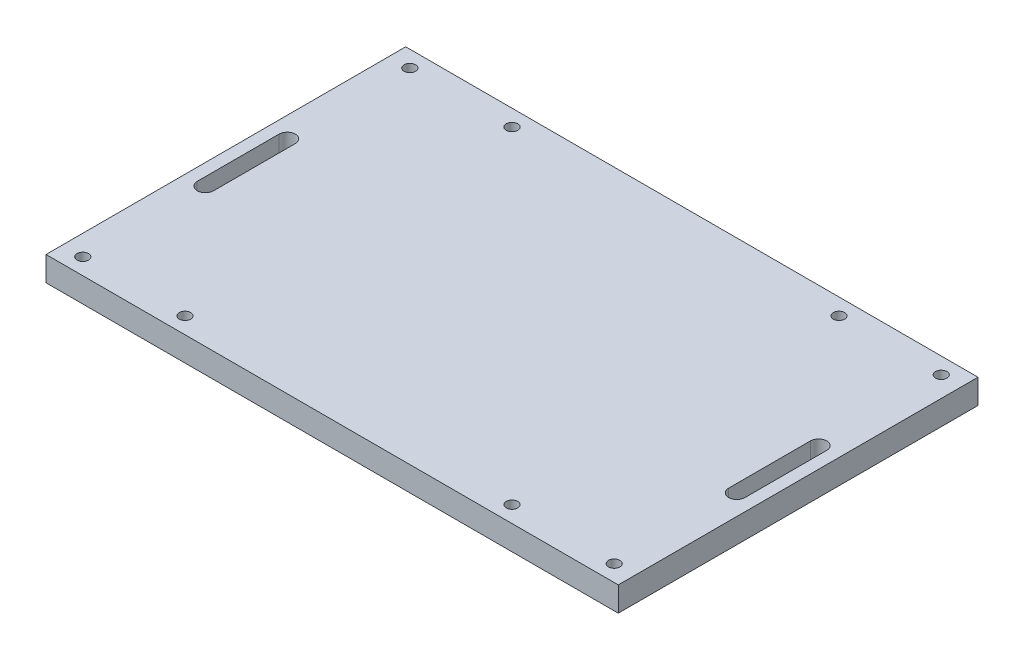
ISO-10303-21;
HEADER;
FILE_DESCRIPTION(('STEP AP214'),'2;1');
FILE_NAME('part.step','',(''),(''),'','','');
FILE_SCHEMA(('AUTOMOTIVE_DESIGN { 1 0 10303 214 1 1 1 1 }'));
ENDSEC;
DATA;
#1=APPLICATION_CONTEXT('core data for automotive mechanical design processes');
#2=APPLICATION_PROTOCOL_DEFINITION('international standard','automotive_design',2000,#1);
#3=PRODUCT_CONTEXT('',#1,'mechanical');
#4=PRODUCT('Part','Part','',(#3));
#5=PRODUCT_RELATED_PRODUCT_CATEGORY('part','',(#4));
#6=PRODUCT_DEFINITION_FORMATION('','',#4);
#7=PRODUCT_DEFINITION_CONTEXT('part definition',#1,'design');
#8=PRODUCT_DEFINITION('design','',#6,#7);
#9=PRODUCT_DEFINITION_SHAPE('','',#8);
#10=(LENGTH_UNIT() NAMED_UNIT(*) SI_UNIT(.MILLI.,.METRE.));
#11=(NAMED_UNIT(*) PLANE_ANGLE_UNIT() SI_UNIT($,.RADIAN.));
#12=(NAMED_UNIT(*) SI_UNIT($,.STERADIAN.) SOLID_ANGLE_UNIT());
#13=UNCERTAINTY_MEASURE_WITH_UNIT(LENGTH_MEASURE(1.E-05),#10,'distance_accuracy_value','');
#14=(GEOMETRIC_REPRESENTATION_CONTEXT(3) GLOBAL_UNCERTAINTY_ASSIGNED_CONTEXT((#13)) GLOBAL_UNIT_ASSIGNED_CONTEXT((#10,
#11,#12)) REPRESENTATION_CONTEXT('',''));
#15=CARTESIAN_POINT('',(0.,0.,0.));
#16=DIRECTION('',(0.,0.,1.));
#17=DIRECTION('',(1.,0.,0.));
#18=AXIS2_PLACEMENT_3D('',#15,#16,#17);
#19=CARTESIAN_POINT('',(0.,7.5,0.));
#20=DIRECTION('',(0.,-1.,0.));
#21=DIRECTION('',(0.,0.,-1.));
#22=AXIS2_PLACEMENT_3D('',#19,#20,#21);
#23=PLANE('',#22);
#24=DIRECTION('',(0.,0.,-1.));
#25=VECTOR('',#24,1.);
#26=CARTESIAN_POINT('',(175.,7.5,110.));
#27=LINE('',#26,#25);
#28=CARTESIAN_POINT('',(175.,7.5,110.));
#29=VERTEX_POINT('',#28);
#30=CARTESIAN_POINT('',(175.,7.5,-110.));
#31=VERTEX_POINT('',#30);
#32=EDGE_CURVE('E261',#29,#31,#27,.T.);
#33=ORIENTED_EDGE('',*,*,#32,.T.);
#34=DIRECTION('',(-1.,0.,0.));
#35=VECTOR('',#34,1.);
#36=CARTESIAN_POINT('',(-175.,7.5,-110.));
#37=LINE('',#36,#35);
#38=CARTESIAN_POINT('',(-175.,7.5,-110.));
#39=VERTEX_POINT('',#38);
#40=EDGE_CURVE('E265',#31,#39,#37,.T.);
#41=ORIENTED_EDGE('',*,*,#40,.T.);
#42=DIRECTION('',(0.,0.,1.));
#43=VECTOR('',#42,1.);
#44=CARTESIAN_POINT('',(-175.,7.5,110.));
#45=LINE('',#44,#43);
#46=CARTESIAN_POINT('',(-175.,7.5,110.));
#47=VERTEX_POINT('',#46);
#48=EDGE_CURVE('E269',#39,#47,#45,.T.);
#49=ORIENTED_EDGE('',*,*,#48,.T.);
#50=DIRECTION('',(1.,0.,0.));
#51=VECTOR('',#50,1.);
#52=CARTESIAN_POINT('',(-175.,7.5,110.));
#53=LINE('',#52,#51);
#54=EDGE_CURVE('E272',#47,#29,#53,.T.);
#55=ORIENTED_EDGE('',*,*,#54,.T.);
#56=EDGE_LOOP('',(#33,#41,#49,#55));
#57=FACE_BOUND('',#56,.T.);
#58=CARTESIAN_POINT('',(-100.,7.5,-100.));
#59=DIRECTION('',(0.,-1.,0.));
#60=DIRECTION('',(0.,0.,-1.));
#61=AXIS2_PLACEMENT_3D('',#58,#59,#60);
#62=CIRCLE('',#61,3.50000000000001);
#63=CARTESIAN_POINT('',(-100.,7.5,-103.5));
#64=VERTEX_POINT('',#63);
#65=EDGE_CURVE('E256',#64,#64,#62,.T.);
#66=ORIENTED_EDGE('',*,*,#65,.T.);
#67=EDGE_LOOP('',(#66));
#68=FACE_BOUND('',#67,.T.);
#69=CARTESIAN_POINT('',(-100.,7.5,100.));
#70=DIRECTION('',(0.,-1.,0.));
#71=DIRECTION('',(0.,0.,-1.));
#72=AXIS2_PLACEMENT_3D('',#69,#70,#71);
#73=CIRCLE('',#72,3.50000000000001);
#74=CARTESIAN_POINT('',(-100.,7.5,96.5));
#75=VERTEX_POINT('',#74);
#76=EDGE_CURVE('E248',#75,#75,#73,.F.);
#77=ORIENTED_EDGE('',*,*,#76,.F.);
#78=EDGE_LOOP('',(#77));
#79=FACE_BOUND('',#78,.T.);
#80=CARTESIAN_POINT('',(100.,7.5,100.));
#81=DIRECTION('',(0.,-1.,0.));
#82=DIRECTION('',(0.,0.,-1.));
#83=AXIS2_PLACEMENT_3D('',#80,#81,#82);
#84=CIRCLE('',#83,3.50000000000001);
#85=CARTESIAN_POINT('',(100.,7.5,96.5));
#86=VERTEX_POINT('',#85);
#87=EDGE_CURVE('E240',#86,#86,#84,.T.);
#88=ORIENTED_EDGE('',*,*,#87,.T.);
#89=EDGE_LOOP('',(#88));
#90=FACE_BOUND('',#89,.T.);
#91=CARTESIAN_POINT('',(100.,7.5,-100.));
#92=DIRECTION('',(0.,-1.,0.));
#93=DIRECTION('',(0.,0.,-1.));
#94=AXIS2_PLACEMENT_3D('',#91,#92,#93);
#95=CIRCLE('',#94,3.50000000000001);
#96=CARTESIAN_POINT('',(100.,7.5,-103.5));
#97=VERTEX_POINT('',#96);
#98=EDGE_CURVE('E231',#97,#97,#95,.F.);
#99=ORIENTED_EDGE('',*,*,#98,.F.);
#100=EDGE_LOOP('',(#99));
#101=FACE_BOUND('',#100,.T.);
#102=DIRECTION('',(0.,0.,-1.));
#103=VECTOR('',#102,1.);
#104=CARTESIAN_POINT('',(-157.5,7.5,25.));
#105=LINE('',#104,#103);
#106=CARTESIAN_POINT('',(-157.5,7.5,25.));
#107=VERTEX_POINT('',#106);
#108=CARTESIAN_POINT('',(-157.5,7.5,-25.));
#109=VERTEX_POINT('',#108);
#110=EDGE_CURVE('E221',#107,#109,#105,.T.);
#111=ORIENTED_EDGE('',*,*,#110,.F.);
#112=CARTESIAN_POINT('',(-162.5,7.5,25.));
#113=DIRECTION('',(0.,1.,0.));
#114=DIRECTION('',(0.,0.,1.));
#115=AXIS2_PLACEMENT_3D('',#112,#113,#114);
#116=CIRCLE('',#115,5.);
#117=CARTESIAN_POINT('',(-167.5,7.5,25.));
#118=VERTEX_POINT('',#117);
#119=EDGE_CURVE('E232',#118,#107,#116,.T.);
#120=ORIENTED_EDGE('',*,*,#119,.F.);
#121=DIRECTION('',(0.,0.,1.));
#122=VECTOR('',#121,1.);
#123=CARTESIAN_POINT('',(-167.5,7.5,25.));
#124=LINE('',#123,#122);
#125=CARTESIAN_POINT('',(-167.5,7.5,-25.));
#126=VERTEX_POINT('',#125);
#127=EDGE_CURVE('E302',#126,#118,#124,.T.);
#128=ORIENTED_EDGE('',*,*,#127,.F.);
#129=CARTESIAN_POINT('',(-162.5,7.5,-25.));
#130=DIRECTION('',(0.,1.,0.));
#131=DIRECTION('',(0.,0.,1.));
#132=AXIS2_PLACEMENT_3D('',#129,#130,#131);
#133=CIRCLE('',#132,5.);
#134=EDGE_CURVE('E299',#109,#126,#133,.T.);
#135=ORIENTED_EDGE('',*,*,#134,.F.);
#136=EDGE_LOOP('',(#111,#120,#128,#135));
#137=FACE_BOUND('',#136,.T.);
#138=CARTESIAN_POINT('',(-162.5,7.5,-100.));
#139=DIRECTION('',(0.,-1.,0.));
#140=DIRECTION('',(0.,0.,-1.));
#141=AXIS2_PLACEMENT_3D('',#138,#139,#140);
#142=CIRCLE('',#141,3.49999999999999);
#143=CARTESIAN_POINT('',(-162.5,7.5,-103.5));
#144=VERTEX_POINT('',#143);
#145=EDGE_CURVE('E191',#144,#144,#142,.T.);
#146=ORIENTED_EDGE('',*,*,#145,.T.);
#147=EDGE_LOOP('',(#146));
#148=FACE_BOUND('',#147,.T.);
#149=CARTESIAN_POINT('',(-162.5,7.5,100.));
#150=DIRECTION('',(0.,-1.,0.));
#151=DIRECTION('',(0.,0.,-1.));
#152=AXIS2_PLACEMENT_3D('',#149,#150,#151);
#153=CIRCLE('',#152,3.49999999999999);
#154=CARTESIAN_POINT('',(-162.5,7.5,96.5));
#155=VERTEX_POINT('',#154);
#156=EDGE_CURVE('E183',#155,#155,#153,.F.);
#157=ORIENTED_EDGE('',*,*,#156,.F.);
#158=EDGE_LOOP('',(#157));
#159=FACE_BOUND('',#158,.T.);
#160=CARTESIAN_POINT('',(162.5,7.5,100.));
#161=DIRECTION('',(0.,-1.,0.));
#162=DIRECTION('',(0.,0.,-1.));
#163=AXIS2_PLACEMENT_3D('',#160,#161,#162);
#164=CIRCLE('',#163,3.49999999999999);
#165=CARTESIAN_POINT('',(162.5,7.5,96.5));
#166=VERTEX_POINT('',#165);
#167=EDGE_CURVE('E175',#166,#166,#164,.T.);
#168=ORIENTED_EDGE('',*,*,#167,.T.);
#169=EDGE_LOOP('',(#168));
#170=FACE_BOUND('',#169,.T.);
#171=CARTESIAN_POINT('',(162.5,7.5,-100.));
#172=DIRECTION('',(0.,-1.,0.));
#173=DIRECTION('',(0.,0.,-1.));
#174=AXIS2_PLACEMENT_3D('',#171,#172,#173);
#175=CIRCLE('',#174,3.49999999999999);
#176=CARTESIAN_POINT('',(162.5,7.5,-103.5));
#177=VERTEX_POINT('',#176);
#178=EDGE_CURVE('E167',#177,#177,#175,.F.);
#179=ORIENTED_EDGE('',*,*,#178,.F.);
#180=EDGE_LOOP('',(#179));
#181=FACE_BOUND('',#180,.T.);
#182=CARTESIAN_POINT('',(162.5,7.5,25.));
#183=DIRECTION('',(0.,1.,0.));
#184=DIRECTION('',(0.,0.,1.));
#185=AXIS2_PLACEMENT_3D('',#182,#183,#184);
#186=CIRCLE('',#185,5.);
#187=CARTESIAN_POINT('',(167.5,7.5,25.));
#188=VERTEX_POINT('',#187);
#189=CARTESIAN_POINT('',(157.5,7.5,25.));
#190=VERTEX_POINT('',#189);
#191=EDGE_CURVE('E42',#188,#190,#186,.F.);
#192=ORIENTED_EDGE('',*,*,#191,.T.);
#193=DIRECTION('',(0.,0.,-1.));
#194=VECTOR('',#193,1.);
#195=CARTESIAN_POINT('',(157.5,7.5,0.));
#196=LINE('',#195,#194);
#197=CARTESIAN_POINT('',(157.5,7.5,-25.));
#198=VERTEX_POINT('',#197);
#199=EDGE_CURVE('E313',#190,#198,#196,.T.);
#200=ORIENTED_EDGE('',*,*,#199,.T.);
#201=CARTESIAN_POINT('',(162.5,7.5,-25.));
#202=DIRECTION('',(0.,1.,0.));
#203=DIRECTION('',(0.,0.,1.));
#204=AXIS2_PLACEMENT_3D('',#201,#202,#203);
#205=CIRCLE('',#204,5.);
#206=CARTESIAN_POINT('',(167.5,7.5,-25.));
#207=VERTEX_POINT('',#206);
#208=EDGE_CURVE('E310',#198,#207,#205,.F.);
#209=ORIENTED_EDGE('',*,*,#208,.T.);
#210=DIRECTION('',(0.,0.,-1.));
#211=VECTOR('',#210,1.);
#212=CARTESIAN_POINT('',(167.5,7.5,0.));
#213=LINE('',#212,#211);
#214=EDGE_CURVE('E156',#207,#188,#213,.F.);
#215=ORIENTED_EDGE('',*,*,#214,.T.);
#216=EDGE_LOOP('',(#192,#200,#209,#215));
#217=FACE_BOUND('',#216,.T.);
#218=ADVANCED_FACE('F38',(#57,#68,#79,#90,#101,#137,#148,#159,#170,#181,#217),#23,.F.);
#219=CARTESIAN_POINT('',(0.,-7.5,0.));
#220=DIRECTION('',(0.,-1.,0.));
#221=DIRECTION('',(0.,0.,-1.));
#222=AXIS2_PLACEMENT_3D('',#219,#220,#221);
#223=PLANE('',#222);
#224=CARTESIAN_POINT('',(162.5,-7.5,-100.));
#225=DIRECTION('',(0.,-1.,0.));
#226=DIRECTION('',(0.,0.,1.));
#227=AXIS2_PLACEMENT_3D('',#224,#225,#226);
#228=CIRCLE('',#227,3.49999999999999);
#229=CARTESIAN_POINT('',(162.5,-7.5,-96.5));
#230=VERTEX_POINT('',#229);
#231=EDGE_CURVE('E163',#230,#230,#228,.T.);
#232=ORIENTED_EDGE('',*,*,#231,.F.);
#233=EDGE_LOOP('',(#232));
#234=FACE_BOUND('',#233,.T.);
#235=CARTESIAN_POINT('',(162.5,-7.5,100.));
#236=DIRECTION('',(0.,1.,0.));
#237=DIRECTION('',(0.,0.,-1.));
#238=AXIS2_PLACEMENT_3D('',#235,#236,#237);
#239=CIRCLE('',#238,3.49999999999999);
#240=CARTESIAN_POINT('',(162.5,-7.5,96.5));
#241=VERTEX_POINT('',#240);
#242=EDGE_CURVE('E171',#241,#241,#239,.T.);
#243=ORIENTED_EDGE('',*,*,#242,.T.);
#244=EDGE_LOOP('',(#243));
#245=FACE_BOUND('',#244,.T.);
#246=CARTESIAN_POINT('',(-162.5,-7.5,100.));
#247=DIRECTION('',(0.,-1.,0.));
#248=DIRECTION('',(0.,0.,-1.));
#249=AXIS2_PLACEMENT_3D('',#246,#247,#248);
#250=CIRCLE('',#249,3.49999999999999);
#251=CARTESIAN_POINT('',(-162.5,-7.5,96.5));
#252=VERTEX_POINT('',#251);
#253=EDGE_CURVE('E179',#252,#252,#250,.T.);
#254=ORIENTED_EDGE('',*,*,#253,.F.);
#255=EDGE_LOOP('',(#254));
#256=FACE_BOUND('',#255,.T.);
#257=CARTESIAN_POINT('',(-162.5,-7.5,-100.));
#258=DIRECTION('',(0.,1.,0.));
#259=DIRECTION('',(0.,0.,1.));
#260=AXIS2_PLACEMENT_3D('',#257,#258,#259);
#261=CIRCLE('',#260,3.49999999999999);
#262=CARTESIAN_POINT('',(-162.5,-7.5,-96.5));
#263=VERTEX_POINT('',#262);
#264=EDGE_CURVE('E187',#263,#263,#261,.T.);
#265=ORIENTED_EDGE('',*,*,#264,.T.);
#266=EDGE_LOOP('',(#265));
#267=FACE_BOUND('',#266,.T.);
#268=CARTESIAN_POINT('',(-162.5,-7.5,25.));
#269=DIRECTION('',(0.,1.,0.));
#270=DIRECTION('',(0.,0.,1.));
#271=AXIS2_PLACEMENT_3D('',#268,#269,#270);
#272=CIRCLE('',#271,5.);
#273=CARTESIAN_POINT('',(-167.5,-7.5,25.));
#274=VERTEX_POINT('',#273);
#275=CARTESIAN_POINT('',(-157.5,-7.5,25.));
#276=VERTEX_POINT('',#275);
#277=EDGE_CURVE('E195',#274,#276,#272,.T.);
#278=ORIENTED_EDGE('',*,*,#277,.T.);
#279=DIRECTION('',(0.,0.,-1.));
#280=VECTOR('',#279,1.);
#281=CARTESIAN_POINT('',(-157.5,-7.5,25.));
#282=LINE('',#281,#280);
#283=CARTESIAN_POINT('',(-157.5,-7.5,-25.));
#284=VERTEX_POINT('',#283);
#285=EDGE_CURVE('E199',#276,#284,#282,.T.);
#286=ORIENTED_EDGE('',*,*,#285,.T.);
#287=CARTESIAN_POINT('',(-162.5,-7.5,-25.));
#288=DIRECTION('',(0.,1.,0.));
#289=DIRECTION('',(0.,0.,1.));
#290=AXIS2_PLACEMENT_3D('',#287,#288,#289);
#291=CIRCLE('',#290,5.);
#292=CARTESIAN_POINT('',(-167.5,-7.5,-25.));
#293=VERTEX_POINT('',#292);
#294=EDGE_CURVE('E203',#284,#293,#291,.T.);
#295=ORIENTED_EDGE('',*,*,#294,.T.);
#296=DIRECTION('',(0.,0.,1.));
#297=VECTOR('',#296,1.);
#298=CARTESIAN_POINT('',(-167.5,-7.5,25.));
#299=LINE('',#298,#297);
#300=EDGE_CURVE('E207',#293,#274,#299,.T.);
#301=ORIENTED_EDGE('',*,*,#300,.T.);
#302=EDGE_LOOP('',(#278,#286,#295,#301));
#303=FACE_BOUND('',#302,.T.);
#304=CARTESIAN_POINT('',(100.,-7.5,-100.));
#305=DIRECTION('',(0.,-1.,0.));
#306=DIRECTION('',(0.,0.,1.));
#307=AXIS2_PLACEMENT_3D('',#304,#305,#306);
#308=CIRCLE('',#307,3.50000000000001);
#309=CARTESIAN_POINT('',(100.,-7.5,-96.5));
#310=VERTEX_POINT('',#309);
#311=EDGE_CURVE('E227',#310,#310,#308,.T.);
#312=ORIENTED_EDGE('',*,*,#311,.F.);
#313=EDGE_LOOP('',(#312));
#314=FACE_BOUND('',#313,.T.);
#315=CARTESIAN_POINT('',(100.,-7.5,100.));
#316=DIRECTION('',(0.,1.,0.));
#317=DIRECTION('',(0.,0.,-1.));
#318=AXIS2_PLACEMENT_3D('',#315,#316,#317);
#319=CIRCLE('',#318,3.50000000000001);
#320=CARTESIAN_POINT('',(100.,-7.5,96.5));
#321=VERTEX_POINT('',#320);
#322=EDGE_CURVE('E236',#321,#321,#319,.T.);
#323=ORIENTED_EDGE('',*,*,#322,.T.);
#324=EDGE_LOOP('',(#323));
#325=FACE_BOUND('',#324,.T.);
#326=CARTESIAN_POINT('',(-100.,-7.5,100.));
#327=DIRECTION('',(0.,-1.,0.));
#328=DIRECTION('',(0.,0.,-1.));
#329=AXIS2_PLACEMENT_3D('',#326,#327,#328);
#330=CIRCLE('',#329,3.50000000000001);
#331=CARTESIAN_POINT('',(-100.,-7.5,96.5));
#332=VERTEX_POINT('',#331);
#333=EDGE_CURVE('E244',#332,#332,#330,.T.);
#334=ORIENTED_EDGE('',*,*,#333,.F.);
#335=EDGE_LOOP('',(#334));
#336=FACE_BOUND('',#335,.T.);
#337=CARTESIAN_POINT('',(-100.,-7.5,-100.));
#338=DIRECTION('',(0.,1.,0.));
#339=DIRECTION('',(0.,0.,1.));
#340=AXIS2_PLACEMENT_3D('',#337,#338,#339);
#341=CIRCLE('',#340,3.50000000000001);
#342=CARTESIAN_POINT('',(-100.,-7.5,-96.5));
#343=VERTEX_POINT('',#342);
#344=EDGE_CURVE('E252',#343,#343,#341,.T.);
#345=ORIENTED_EDGE('',*,*,#344,.T.);
#346=EDGE_LOOP('',(#345));
#347=FACE_BOUND('',#346,.T.);
#348=DIRECTION('',(0.,0.,-1.));
#349=VECTOR('',#348,1.);
#350=CARTESIAN_POINT('',(175.,-7.5,110.));
#351=LINE('',#350,#349);
#352=CARTESIAN_POINT('',(175.,-7.5,110.));
#353=VERTEX_POINT('',#352);
#354=CARTESIAN_POINT('',(175.,-7.5,-110.));
#355=VERTEX_POINT('',#354);
#356=EDGE_CURVE('E260',#353,#355,#351,.T.);
#357=ORIENTED_EDGE('',*,*,#356,.F.);
#358=DIRECTION('',(1.,0.,0.));
#359=VECTOR('',#358,1.);
#360=CARTESIAN_POINT('',(-175.,-7.5,110.));
#361=LINE('',#360,#359);
#362=CARTESIAN_POINT('',(-175.,-7.5,110.));
#363=VERTEX_POINT('',#362);
#364=EDGE_CURVE('E266',#363,#353,#361,.T.);
#365=ORIENTED_EDGE('',*,*,#364,.F.);
#366=DIRECTION('',(0.,0.,1.));
#367=VECTOR('',#366,1.);
#368=CARTESIAN_POINT('',(-175.,-7.5,110.));
#369=LINE('',#368,#367);
#370=CARTESIAN_POINT('',(-175.,-7.5,-110.));
#371=VERTEX_POINT('',#370);
#372=EDGE_CURVE('E282',#371,#363,#369,.T.);
#373=ORIENTED_EDGE('',*,*,#372,.F.);
#374=DIRECTION('',(-1.,0.,0.));
#375=VECTOR('',#374,1.);
#376=CARTESIAN_POINT('',(-175.,-7.5,-110.));
#377=LINE('',#376,#375);
#378=EDGE_CURVE('E279',#355,#371,#377,.T.);
#379=ORIENTED_EDGE('',*,*,#378,.F.);
#380=EDGE_LOOP('',(#357,#365,#373,#379));
#381=FACE_BOUND('',#380,.T.);
#382=DIRECTION('',(0.,0.,-1.));
#383=VECTOR('',#382,1.);
#384=CARTESIAN_POINT('',(157.5,-7.5,25.));
#385=LINE('',#384,#383);
#386=CARTESIAN_POINT('',(157.5,-7.5,25.));
#387=VERTEX_POINT('',#386);
#388=CARTESIAN_POINT('',(157.5,-7.5,-25.));
#389=VERTEX_POINT('',#388);
#390=EDGE_CURVE('E142',#387,#389,#385,.T.);
#391=ORIENTED_EDGE('',*,*,#390,.F.);
#392=CARTESIAN_POINT('',(162.5,-7.5,25.));
#393=DIRECTION('',(0.,-1.,0.));
#394=DIRECTION('',(0.,0.,1.));
#395=AXIS2_PLACEMENT_3D('',#392,#393,#394);
#396=CIRCLE('',#395,5.);
#397=CARTESIAN_POINT('',(167.5,-7.5,25.));
#398=VERTEX_POINT('',#397);
#399=EDGE_CURVE('E133',#398,#387,#396,.T.);
#400=ORIENTED_EDGE('',*,*,#399,.F.);
#401=DIRECTION('',(0.,0.,1.));
#402=VECTOR('',#401,1.);
#403=CARTESIAN_POINT('',(167.5,-7.5,25.));
#404=LINE('',#403,#402);
#405=CARTESIAN_POINT('',(167.5,-7.5,-25.));
#406=VERTEX_POINT('',#405);
#407=EDGE_CURVE('E123',#406,#398,#404,.T.);
#408=ORIENTED_EDGE('',*,*,#407,.F.);
#409=CARTESIAN_POINT('',(162.5,-7.5,-25.));
#410=DIRECTION('',(0.,-1.,0.));
#411=DIRECTION('',(0.,0.,1.));
#412=AXIS2_PLACEMENT_3D('',#409,#410,#411);
#413=CIRCLE('',#412,5.);
#414=EDGE_CURVE('E132',#389,#406,#413,.T.);
#415=ORIENTED_EDGE('',*,*,#414,.F.);
#416=EDGE_LOOP('',(#391,#400,#408,#415));
#417=FACE_BOUND('',#416,.T.);
#418=ADVANCED_FACE('F145',(#234,#245,#256,#267,#303,#314,#325,#336,#347,#381,#417),#223,.T.);
#419=CARTESIAN_POINT('',(175.,7.5,110.));
#420=DIRECTION('',(-1.,0.,0.));
#421=DIRECTION('',(0.,0.,1.));
#422=AXIS2_PLACEMENT_3D('',#419,#420,#421);
#423=PLANE('',#422);
#424=ORIENTED_EDGE('',*,*,#356,.T.);
#425=DIRECTION('',(0.,-1.,0.));
#426=VECTOR('',#425,1.);
#427=CARTESIAN_POINT('',(175.,7.5,-110.));
#428=LINE('',#427,#426);
#429=EDGE_CURVE('E11',#31,#355,#428,.T.);
#430=ORIENTED_EDGE('',*,*,#429,.F.);
#431=ORIENTED_EDGE('',*,*,#32,.F.);
#432=DIRECTION('',(0.,-1.,0.));
#433=VECTOR('',#432,1.);
#434=CARTESIAN_POINT('',(175.,7.5,110.));
#435=LINE('',#434,#433);
#436=EDGE_CURVE('E275',#29,#353,#435,.T.);
#437=ORIENTED_EDGE('',*,*,#436,.T.);
#438=EDGE_LOOP('',(#424,#430,#431,#437));
#439=FACE_BOUND('',#438,.T.);
#440=ADVANCED_FACE('F40',(#439),#423,.F.);
#441=CARTESIAN_POINT('',(-175.,7.5,-110.));
#442=DIRECTION('',(0.,0.,1.));
#443=DIRECTION('',(1.,0.,0.));
#444=AXIS2_PLACEMENT_3D('',#441,#442,#443);
#445=PLANE('',#444);
#446=ORIENTED_EDGE('',*,*,#378,.T.);
#447=DIRECTION('',(0.,-1.,0.));
#448=VECTOR('',#447,1.);
#449=CARTESIAN_POINT('',(-175.,7.5,-110.));
#450=LINE('',#449,#448);
#451=EDGE_CURVE('E49',#39,#371,#450,.T.);
#452=ORIENTED_EDGE('',*,*,#451,.F.);
#453=ORIENTED_EDGE('',*,*,#40,.F.);
#454=ORIENTED_EDGE('',*,*,#429,.T.);
#455=EDGE_LOOP('',(#446,#452,#453,#454));
#456=FACE_BOUND('',#455,.T.);
#457=ADVANCED_FACE('F352',(#456),#445,.F.);
#458=CARTESIAN_POINT('',(-175.,7.5,110.));
#459=DIRECTION('',(1.,0.,0.));
#460=DIRECTION('',(0.,0.,-1.));
#461=AXIS2_PLACEMENT_3D('',#458,#459,#460);
#462=PLANE('',#461);
#463=ORIENTED_EDGE('',*,*,#372,.T.);
#464=DIRECTION('',(0.,-1.,0.));
#465=VECTOR('',#464,1.);
#466=CARTESIAN_POINT('',(-175.,7.5,110.));
#467=LINE('',#466,#465);
#468=EDGE_CURVE('E290',#47,#363,#467,.T.);
#469=ORIENTED_EDGE('',*,*,#468,.F.);
#470=ORIENTED_EDGE('',*,*,#48,.F.);
#471=ORIENTED_EDGE('',*,*,#451,.T.);
#472=EDGE_LOOP('',(#463,#469,#470,#471));
#473=FACE_BOUND('',#472,.T.);
#474=ADVANCED_FACE('F349',(#473),#462,.F.);
#475=CARTESIAN_POINT('',(-175.,7.5,110.));
#476=DIRECTION('',(0.,0.,-1.));
#477=DIRECTION('',(-1.,0.,0.));
#478=AXIS2_PLACEMENT_3D('',#475,#476,#477);
#479=PLANE('',#478);
#480=ORIENTED_EDGE('',*,*,#364,.T.);
#481=ORIENTED_EDGE('',*,*,#436,.F.);
#482=ORIENTED_EDGE('',*,*,#54,.F.);
#483=ORIENTED_EDGE('',*,*,#468,.T.);
#484=EDGE_LOOP('',(#480,#481,#482,#483));
#485=FACE_BOUND('',#484,.T.);
#486=ADVANCED_FACE('F346',(#485),#479,.F.);
#487=CARTESIAN_POINT('',(-100.,-7.5,-100.));
#488=DIRECTION('',(0.,1.,0.));
#489=DIRECTION('',(0.,0.,1.));
#490=AXIS2_PLACEMENT_3D('',#487,#488,#489);
#491=CYLINDRICAL_SURFACE('',#490,3.50000000000001);
#492=ORIENTED_EDGE('',*,*,#344,.F.);
#493=EDGE_LOOP('',(#492));
#494=FACE_BOUND('',#493,.T.);
#495=ORIENTED_EDGE('',*,*,#65,.F.);
#496=EDGE_LOOP('',(#495));
#497=FACE_BOUND('',#496,.T.);
#498=ADVANCED_FACE('F343',(#494,#497),#491,.F.);
#499=CARTESIAN_POINT('',(-100.,-7.5,100.));
#500=DIRECTION('',(0.,1.,0.));
#501=DIRECTION('',(0.,0.,1.));
#502=AXIS2_PLACEMENT_3D('',#499,#500,#501);
#503=CYLINDRICAL_SURFACE('',#502,3.50000000000001);
#504=ORIENTED_EDGE('',*,*,#333,.T.);
#505=EDGE_LOOP('',(#504));
#506=FACE_BOUND('',#505,.T.);
#507=ORIENTED_EDGE('',*,*,#76,.T.);
#508=EDGE_LOOP('',(#507));
#509=FACE_BOUND('',#508,.T.);
#510=ADVANCED_FACE('F398',(#506,#509),#503,.F.);
#511=CARTESIAN_POINT('',(100.,-7.5,100.));
#512=DIRECTION('',(0.,1.,0.));
#513=DIRECTION('',(0.,0.,1.));
#514=AXIS2_PLACEMENT_3D('',#511,#512,#513);
#515=CYLINDRICAL_SURFACE('',#514,3.50000000000001);
#516=ORIENTED_EDGE('',*,*,#322,.F.);
#517=EDGE_LOOP('',(#516));
#518=FACE_BOUND('',#517,.T.);
#519=ORIENTED_EDGE('',*,*,#87,.F.);
#520=EDGE_LOOP('',(#519));
#521=FACE_BOUND('',#520,.T.);
#522=ADVANCED_FACE('F407',(#518,#521),#515,.F.);
#523=CARTESIAN_POINT('',(100.,-7.5,-100.));
#524=DIRECTION('',(0.,1.,0.));
#525=DIRECTION('',(0.,0.,1.));
#526=AXIS2_PLACEMENT_3D('',#523,#524,#525);
#527=CYLINDRICAL_SURFACE('',#526,3.50000000000001);
#528=ORIENTED_EDGE('',*,*,#311,.T.);
#529=EDGE_LOOP('',(#528));
#530=FACE_BOUND('',#529,.T.);
#531=ORIENTED_EDGE('',*,*,#98,.T.);
#532=EDGE_LOOP('',(#531));
#533=FACE_BOUND('',#532,.T.);
#534=ADVANCED_FACE('F416',(#530,#533),#527,.F.);
#535=CARTESIAN_POINT('',(-162.5,-7.5,25.));
#536=DIRECTION('',(0.,1.,0.));
#537=DIRECTION('',(0.,0.,1.));
#538=AXIS2_PLACEMENT_3D('',#535,#536,#537);
#539=CYLINDRICAL_SURFACE('',#538,5.);
#540=DIRECTION('',(0.,1.,0.));
#541=VECTOR('',#540,1.);
#542=CARTESIAN_POINT('',(-157.5,-7.5,25.));
#543=LINE('',#542,#541);
#544=EDGE_CURVE('E211',#276,#107,#543,.T.);
#545=ORIENTED_EDGE('',*,*,#544,.F.);
#546=ORIENTED_EDGE('',*,*,#277,.F.);
#547=DIRECTION('',(0.,1.,0.));
#548=VECTOR('',#547,1.);
#549=CARTESIAN_POINT('',(-167.5,-7.5,25.));
#550=LINE('',#549,#548);
#551=EDGE_CURVE('E216',#274,#118,#550,.T.);
#552=ORIENTED_EDGE('',*,*,#551,.T.);
#553=ORIENTED_EDGE('',*,*,#119,.T.);
#554=EDGE_LOOP('',(#545,#546,#552,#553));
#555=FACE_BOUND('',#554,.T.);
#556=ADVANCED_FACE('F426',(#555),#539,.F.);
#557=CARTESIAN_POINT('',(-167.5,-7.5,25.));
#558=DIRECTION('',(-1.,0.,0.));
#559=DIRECTION('',(0.,0.,1.));
#560=AXIS2_PLACEMENT_3D('',#557,#558,#559);
#561=PLANE('',#560);
#562=ORIENTED_EDGE('',*,*,#551,.F.);
#563=ORIENTED_EDGE('',*,*,#300,.F.);
#564=DIRECTION('',(0.,1.,0.));
#565=VECTOR('',#564,1.);
#566=CARTESIAN_POINT('',(-167.5,-7.5,-25.));
#567=LINE('',#566,#565);
#568=EDGE_CURVE('E212',#293,#126,#567,.T.);
#569=ORIENTED_EDGE('',*,*,#568,.T.);
#570=ORIENTED_EDGE('',*,*,#127,.T.);
#571=EDGE_LOOP('',(#562,#563,#569,#570));
#572=FACE_BOUND('',#571,.T.);
#573=ADVANCED_FACE('F436',(#572),#561,.F.);
#574=CARTESIAN_POINT('',(-162.5,-7.5,-25.));
#575=DIRECTION('',(0.,1.,0.));
#576=DIRECTION('',(0.,0.,1.));
#577=AXIS2_PLACEMENT_3D('',#574,#575,#576);
#578=CYLINDRICAL_SURFACE('',#577,5.);
#579=ORIENTED_EDGE('',*,*,#568,.F.);
#580=ORIENTED_EDGE('',*,*,#294,.F.);
#581=DIRECTION('',(0.,1.,0.));
#582=VECTOR('',#581,1.);
#583=CARTESIAN_POINT('',(-157.5,-7.5,-25.));
#584=LINE('',#583,#582);
#585=EDGE_CURVE('E217',#284,#109,#584,.T.);
#586=ORIENTED_EDGE('',*,*,#585,.T.);
#587=ORIENTED_EDGE('',*,*,#134,.T.);
#588=EDGE_LOOP('',(#579,#580,#586,#587));
#589=FACE_BOUND('',#588,.T.);
#590=ADVANCED_FACE('F446',(#589),#578,.F.);
#591=CARTESIAN_POINT('',(-157.5,-7.5,25.));
#592=DIRECTION('',(1.,0.,0.));
#593=DIRECTION('',(0.,0.,-1.));
#594=AXIS2_PLACEMENT_3D('',#591,#592,#593);
#595=PLANE('',#594);
#596=ORIENTED_EDGE('',*,*,#585,.F.);
#597=ORIENTED_EDGE('',*,*,#285,.F.);
#598=ORIENTED_EDGE('',*,*,#544,.T.);
#599=ORIENTED_EDGE('',*,*,#110,.T.);
#600=EDGE_LOOP('',(#596,#597,#598,#599));
#601=FACE_BOUND('',#600,.T.);
#602=ADVANCED_FACE('F456',(#601),#595,.F.);
#603=CARTESIAN_POINT('',(-162.5,-7.5,-100.));
#604=DIRECTION('',(0.,1.,0.));
#605=DIRECTION('',(0.,0.,1.));
#606=AXIS2_PLACEMENT_3D('',#603,#604,#605);
#607=CYLINDRICAL_SURFACE('',#606,3.49999999999999);
#608=ORIENTED_EDGE('',*,*,#264,.F.);
#609=EDGE_LOOP('',(#608));
#610=FACE_BOUND('',#609,.T.);
#611=ORIENTED_EDGE('',*,*,#145,.F.);
#612=EDGE_LOOP('',(#611));
#613=FACE_BOUND('',#612,.T.);
#614=ADVANCED_FACE('F466',(#610,#613),#607,.F.);
#615=CARTESIAN_POINT('',(-162.5,-7.5,100.));
#616=DIRECTION('',(0.,1.,0.));
#617=DIRECTION('',(0.,0.,1.));
#618=AXIS2_PLACEMENT_3D('',#615,#616,#617);
#619=CYLINDRICAL_SURFACE('',#618,3.49999999999999);
#620=ORIENTED_EDGE('',*,*,#253,.T.);
#621=EDGE_LOOP('',(#620));
#622=FACE_BOUND('',#621,.T.);
#623=ORIENTED_EDGE('',*,*,#156,.T.);
#624=EDGE_LOOP('',(#623));
#625=FACE_BOUND('',#624,.T.);
#626=ADVANCED_FACE('F476',(#622,#625),#619,.F.);
#627=CARTESIAN_POINT('',(162.5,-7.5,100.));
#628=DIRECTION('',(0.,1.,0.));
#629=DIRECTION('',(0.,0.,1.));
#630=AXIS2_PLACEMENT_3D('',#627,#628,#629);
#631=CYLINDRICAL_SURFACE('',#630,3.49999999999999);
#632=ORIENTED_EDGE('',*,*,#242,.F.);
#633=EDGE_LOOP('',(#632));
#634=FACE_BOUND('',#633,.T.);
#635=ORIENTED_EDGE('',*,*,#167,.F.);
#636=EDGE_LOOP('',(#635));
#637=FACE_BOUND('',#636,.T.);
#638=ADVANCED_FACE('F486',(#634,#637),#631,.F.);
#639=CARTESIAN_POINT('',(162.5,-7.5,-100.));
#640=DIRECTION('',(0.,1.,0.));
#641=DIRECTION('',(0.,0.,1.));
#642=AXIS2_PLACEMENT_3D('',#639,#640,#641);
#643=CYLINDRICAL_SURFACE('',#642,3.49999999999999);
#644=ORIENTED_EDGE('',*,*,#231,.T.);
#645=EDGE_LOOP('',(#644));
#646=FACE_BOUND('',#645,.T.);
#647=ORIENTED_EDGE('',*,*,#178,.T.);
#648=EDGE_LOOP('',(#647));
#649=FACE_BOUND('',#648,.T.);
#650=ADVANCED_FACE('F495',(#646,#649),#643,.F.);
#651=CARTESIAN_POINT('',(162.5,-7.5,25.));
#652=DIRECTION('',(0.,1.,0.));
#653=DIRECTION('',(0.,0.,1.));
#654=AXIS2_PLACEMENT_3D('',#651,#652,#653);
#655=CYLINDRICAL_SURFACE('',#654,5.);
#656=ORIENTED_EDGE('',*,*,#191,.F.);
#657=DIRECTION('',(0.,1.,0.));
#658=VECTOR('',#657,1.);
#659=CARTESIAN_POINT('',(167.5,-7.5,25.));
#660=LINE('',#659,#658);
#661=EDGE_CURVE('E57',#398,#188,#660,.T.);
#662=ORIENTED_EDGE('',*,*,#661,.F.);
#663=ORIENTED_EDGE('',*,*,#399,.T.);
#664=DIRECTION('',(0.,1.,0.));
#665=VECTOR('',#664,1.);
#666=CARTESIAN_POINT('',(157.5,-7.5,25.));
#667=LINE('',#666,#665);
#668=EDGE_CURVE('E153',#387,#190,#667,.T.);
#669=ORIENTED_EDGE('',*,*,#668,.T.);
#670=EDGE_LOOP('',(#656,#662,#663,#669));
#671=FACE_BOUND('',#670,.T.);
#672=ADVANCED_FACE('F136',(#671),#655,.F.);
#673=CARTESIAN_POINT('',(157.5,-7.5,25.));
#674=DIRECTION('',(1.,0.,0.));
#675=DIRECTION('',(0.,0.,-1.));
#676=AXIS2_PLACEMENT_3D('',#673,#674,#675);
#677=PLANE('',#676);
#678=ORIENTED_EDGE('',*,*,#199,.F.);
#679=ORIENTED_EDGE('',*,*,#668,.F.);
#680=ORIENTED_EDGE('',*,*,#390,.T.);
#681=DIRECTION('',(0.,1.,0.));
#682=VECTOR('',#681,1.);
#683=CARTESIAN_POINT('',(157.5,-7.5,-25.));
#684=LINE('',#683,#682);
#685=EDGE_CURVE('E157',#389,#198,#684,.T.);
#686=ORIENTED_EDGE('',*,*,#685,.T.);
#687=EDGE_LOOP('',(#678,#679,#680,#686));
#688=FACE_BOUND('',#687,.T.);
#689=ADVANCED_FACE('F320',(#688),#677,.T.);
#690=CARTESIAN_POINT('',(162.5,-7.5,-25.));
#691=DIRECTION('',(0.,1.,0.));
#692=DIRECTION('',(0.,0.,1.));
#693=AXIS2_PLACEMENT_3D('',#690,#691,#692);
#694=CYLINDRICAL_SURFACE('',#693,5.);
#695=ORIENTED_EDGE('',*,*,#208,.F.);
#696=ORIENTED_EDGE('',*,*,#685,.F.);
#697=ORIENTED_EDGE('',*,*,#414,.T.);
#698=DIRECTION('',(0.,1.,0.));
#699=VECTOR('',#698,1.);
#700=CARTESIAN_POINT('',(167.5,-7.5,-25.));
#701=LINE('',#700,#699);
#702=EDGE_CURVE('E126',#406,#207,#701,.T.);
#703=ORIENTED_EDGE('',*,*,#702,.T.);
#704=EDGE_LOOP('',(#695,#696,#697,#703));
#705=FACE_BOUND('',#704,.T.);
#706=ADVANCED_FACE('F323',(#705),#694,.F.);
#707=CARTESIAN_POINT('',(167.5,-7.5,25.));
#708=DIRECTION('',(-1.,0.,0.));
#709=DIRECTION('',(0.,0.,1.));
#710=AXIS2_PLACEMENT_3D('',#707,#708,#709);
#711=PLANE('',#710);
#712=ORIENTED_EDGE('',*,*,#214,.F.);
#713=ORIENTED_EDGE('',*,*,#702,.F.);
#714=ORIENTED_EDGE('',*,*,#407,.T.);
#715=ORIENTED_EDGE('',*,*,#661,.T.);
#716=EDGE_LOOP('',(#712,#713,#714,#715));
#717=FACE_BOUND('',#716,.T.);
#718=ADVANCED_FACE('F124',(#717),#711,.T.);
#719=CLOSED_SHELL('',(#218,#418,#440,#457,#474,#486,#498,#510,#522,#534,#556,#573,#590,#602,
#614,#626,#638,#650,#672,#689,#706,#718));
#720=MANIFOLD_SOLID_BREP('B2',#719);
#721=ADVANCED_BREP_SHAPE_REPRESENTATION('',(#18,#720),#14);
#722=SHAPE_DEFINITION_REPRESENTATION(#9,#721);
ENDSEC;
END-ISO-10303-21;
